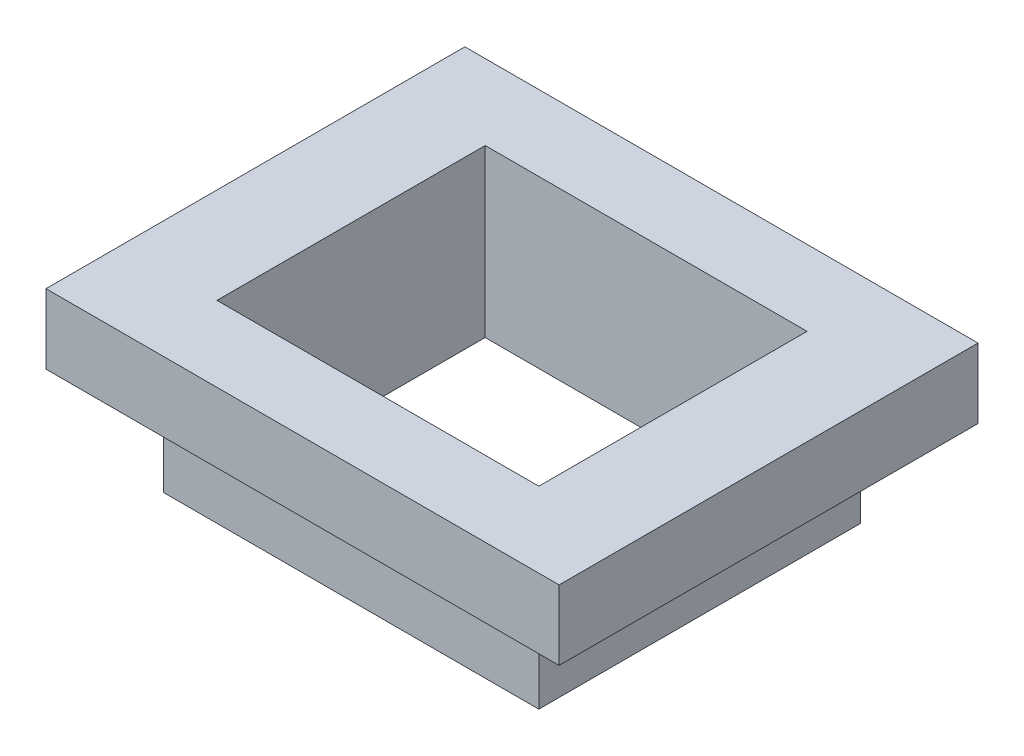
ISO-10303-21;
HEADER;
FILE_DESCRIPTION(('STEP AP214'),'2;1');
FILE_NAME('part.step','',(''),(''),'','','');
FILE_SCHEMA(('AUTOMOTIVE_DESIGN { 1 0 10303 214 1 1 1 1 }'));
ENDSEC;
DATA;
#1=APPLICATION_CONTEXT('core data for automotive mechanical design processes');
#2=APPLICATION_PROTOCOL_DEFINITION('international standard','automotive_design',2000,#1);
#3=PRODUCT_CONTEXT('',#1,'mechanical');
#4=PRODUCT('Part','Part','',(#3));
#5=PRODUCT_RELATED_PRODUCT_CATEGORY('part','',(#4));
#6=PRODUCT_DEFINITION_FORMATION('','',#4);
#7=PRODUCT_DEFINITION_CONTEXT('part definition',#1,'design');
#8=PRODUCT_DEFINITION('design','',#6,#7);
#9=PRODUCT_DEFINITION_SHAPE('','',#8);
#10=(LENGTH_UNIT() NAMED_UNIT(*) SI_UNIT(.MILLI.,.METRE.));
#11=(NAMED_UNIT(*) PLANE_ANGLE_UNIT() SI_UNIT($,.RADIAN.));
#12=(NAMED_UNIT(*) SI_UNIT($,.STERADIAN.) SOLID_ANGLE_UNIT());
#13=UNCERTAINTY_MEASURE_WITH_UNIT(LENGTH_MEASURE(1.E-05),#10,'distance_accuracy_value','');
#14=(GEOMETRIC_REPRESENTATION_CONTEXT(3) GLOBAL_UNCERTAINTY_ASSIGNED_CONTEXT((#13)) GLOBAL_UNIT_ASSIGNED_CONTEXT((#10,
#11,#12)) REPRESENTATION_CONTEXT('',''));
#15=CARTESIAN_POINT('',(0.,0.,0.));
#16=DIRECTION('',(0.,0.,1.));
#17=DIRECTION('',(1.,0.,0.));
#18=AXIS2_PLACEMENT_3D('',#15,#16,#17);
#19=CARTESIAN_POINT('',(0.,130.,0.));
#20=DIRECTION('',(0.,1.,0.));
#21=DIRECTION('',(0.,0.,1.));
#22=AXIS2_PLACEMENT_3D('',#19,#20,#21);
#23=PLANE('',#22);
#24=DIRECTION('',(0.,0.,1.));
#25=VECTOR('',#24,1.);
#26=CARTESIAN_POINT('',(-460.978313253012,130.,-161.342409638554));
#27=LINE('',#26,#25);
#28=CARTESIAN_POINT('',(-460.978313253012,130.,-161.342409638554));
#29=VERTEX_POINT('',#28);
#30=CARTESIAN_POINT('',(-460.978313253012,130.,619.537590361446));
#31=VERTEX_POINT('',#30);
#32=EDGE_CURVE('E193',#29,#31,#27,.T.);
#33=ORIENTED_EDGE('',*,*,#32,.T.);
#34=DIRECTION('',(1.,0.,0.));
#35=VECTOR('',#34,1.);
#36=CARTESIAN_POINT('',(-460.978313253012,130.,619.537590361446));
#37=LINE('',#36,#35);
#38=CARTESIAN_POINT('',(495.551686746988,130.,619.537590361446));
#39=VERTEX_POINT('',#38);
#40=EDGE_CURVE('E196',#31,#39,#37,.T.);
#41=ORIENTED_EDGE('',*,*,#40,.T.);
#42=DIRECTION('',(0.,0.,-1.));
#43=VECTOR('',#42,1.);
#44=CARTESIAN_POINT('',(495.551686746988,130.,-161.342409638554));
#45=LINE('',#44,#43);
#46=CARTESIAN_POINT('',(495.551686746988,130.,-161.342409638554));
#47=VERTEX_POINT('',#46);
#48=EDGE_CURVE('E199',#39,#47,#45,.T.);
#49=ORIENTED_EDGE('',*,*,#48,.T.);
#50=DIRECTION('',(-1.,0.,0.));
#51=VECTOR('',#50,1.);
#52=CARTESIAN_POINT('',(-460.978313253012,130.,-161.342409638554));
#53=LINE('',#52,#51);
#54=EDGE_CURVE('E201',#47,#29,#53,.T.);
#55=ORIENTED_EDGE('',*,*,#54,.T.);
#56=EDGE_LOOP('',(#33,#41,#49,#55));
#57=FACE_BOUND('',#56,.T.);
#58=DIRECTION('',(0.,0.,1.));
#59=VECTOR('',#58,1.);
#60=CARTESIAN_POINT('',(-282.713313253012,130.,229.097590361446));
#61=LINE('',#60,#59);
#62=CARTESIAN_POINT('',(-282.713313253012,130.,-20.9024096385541));
#63=VERTEX_POINT('',#62);
#64=CARTESIAN_POINT('',(-282.713313253012,130.,479.097590361446));
#65=VERTEX_POINT('',#64);
#66=EDGE_CURVE('E185',#63,#65,#61,.T.);
#67=ORIENTED_EDGE('',*,*,#66,.F.);
#68=DIRECTION('',(-1.,0.,0.));
#69=VECTOR('',#68,1.);
#70=CARTESIAN_POINT('',(17.2866867469881,130.,-20.9024096385542));
#71=LINE('',#70,#69);
#72=CARTESIAN_POINT('',(317.286686746988,130.,-20.9024096385542));
#73=VERTEX_POINT('',#72);
#74=EDGE_CURVE('E183',#73,#63,#71,.T.);
#75=ORIENTED_EDGE('',*,*,#74,.F.);
#76=DIRECTION('',(0.,0.,-1.));
#77=VECTOR('',#76,1.);
#78=CARTESIAN_POINT('',(317.286686746988,130.,229.097590361446));
#79=LINE('',#78,#77);
#80=CARTESIAN_POINT('',(317.286686746988,130.,479.097590361446));
#81=VERTEX_POINT('',#80);
#82=EDGE_CURVE('E128',#81,#73,#79,.T.);
#83=ORIENTED_EDGE('',*,*,#82,.F.);
#84=DIRECTION('',(1.,0.,0.));
#85=VECTOR('',#84,1.);
#86=CARTESIAN_POINT('',(17.286686746988,130.,479.097590361446));
#87=LINE('',#86,#85);
#88=EDGE_CURVE('E187',#65,#81,#87,.T.);
#89=ORIENTED_EDGE('',*,*,#88,.F.);
#90=EDGE_LOOP('',(#67,#75,#83,#89));
#91=FACE_BOUND('',#90,.T.);
#92=ADVANCED_FACE('F35',(#57,#91),#23,.T.);
#93=CARTESIAN_POINT('',(0.,0.,0.));
#94=DIRECTION('',(0.,1.,0.));
#95=DIRECTION('',(0.,0.,1.));
#96=AXIS2_PLACEMENT_3D('',#93,#94,#95);
#97=PLANE('',#96);
#98=DIRECTION('',(1.,0.,0.));
#99=VECTOR('',#98,1.);
#100=CARTESIAN_POINT('',(0.,0.,529.097590361446));
#101=LINE('',#100,#99);
#102=CARTESIAN_POINT('',(-332.713313253012,0.,529.097590361446));
#103=VERTEX_POINT('',#102);
#104=CARTESIAN_POINT('',(367.286686746988,0.,529.097590361446));
#105=VERTEX_POINT('',#104);
#106=EDGE_CURVE('E171',#103,#105,#101,.T.);
#107=ORIENTED_EDGE('',*,*,#106,.T.);
#108=DIRECTION('',(0.,0.,-1.));
#109=VECTOR('',#108,1.);
#110=CARTESIAN_POINT('',(367.286686746988,0.,0.));
#111=LINE('',#110,#109);
#112=CARTESIAN_POINT('',(367.286686746988,0.,-70.9024096385541));
#113=VERTEX_POINT('',#112);
#114=EDGE_CURVE('E168',#105,#113,#111,.T.);
#115=ORIENTED_EDGE('',*,*,#114,.T.);
#116=DIRECTION('',(-1.,0.,0.));
#117=VECTOR('',#116,1.);
#118=CARTESIAN_POINT('',(0.,0.,-70.9024096385541));
#119=LINE('',#118,#117);
#120=CARTESIAN_POINT('',(-332.713313253012,0.,-70.9024096385541));
#121=VERTEX_POINT('',#120);
#122=EDGE_CURVE('E148',#113,#121,#119,.T.);
#123=ORIENTED_EDGE('',*,*,#122,.T.);
#124=DIRECTION('',(0.,0.,1.));
#125=VECTOR('',#124,1.);
#126=CARTESIAN_POINT('',(-332.713313253012,0.,0.));
#127=LINE('',#126,#125);
#128=EDGE_CURVE('E50',#121,#103,#127,.T.);
#129=ORIENTED_EDGE('',*,*,#128,.T.);
#130=EDGE_LOOP('',(#107,#115,#123,#129));
#131=FACE_BOUND('',#130,.T.);
#132=DIRECTION('',(0.,0.,1.));
#133=VECTOR('',#132,1.);
#134=CARTESIAN_POINT('',(-460.978313253012,0.,-161.342409638554));
#135=LINE('',#134,#133);
#136=CARTESIAN_POINT('',(-460.978313253012,0.,-161.342409638554));
#137=VERTEX_POINT('',#136);
#138=CARTESIAN_POINT('',(-460.978313253012,0.,619.537590361446));
#139=VERTEX_POINT('',#138);
#140=EDGE_CURVE('E131',#137,#139,#135,.T.);
#141=ORIENTED_EDGE('',*,*,#140,.F.);
#142=DIRECTION('',(-1.,0.,0.));
#143=VECTOR('',#142,1.);
#144=CARTESIAN_POINT('',(-460.978313253012,0.,-161.342409638554));
#145=LINE('',#144,#143);
#146=CARTESIAN_POINT('',(495.551686746988,0.,-161.342409638554));
#147=VERTEX_POINT('',#146);
#148=EDGE_CURVE('E197',#147,#137,#145,.T.);
#149=ORIENTED_EDGE('',*,*,#148,.F.);
#150=DIRECTION('',(0.,0.,-1.));
#151=VECTOR('',#150,1.);
#152=CARTESIAN_POINT('',(495.551686746988,0.,-161.342409638554));
#153=LINE('',#152,#151);
#154=CARTESIAN_POINT('',(495.551686746988,0.,619.537590361446));
#155=VERTEX_POINT('',#154);
#156=EDGE_CURVE('E208',#155,#147,#153,.T.);
#157=ORIENTED_EDGE('',*,*,#156,.F.);
#158=DIRECTION('',(1.,0.,0.));
#159=VECTOR('',#158,1.);
#160=CARTESIAN_POINT('',(-460.978313253012,0.,619.537590361446));
#161=LINE('',#160,#159);
#162=EDGE_CURVE('E206',#139,#155,#161,.T.);
#163=ORIENTED_EDGE('',*,*,#162,.F.);
#164=EDGE_LOOP('',(#141,#149,#157,#163));
#165=FACE_BOUND('',#164,.T.);
#166=ADVANCED_FACE('F226',(#131,#165),#97,.F.);
#167=CARTESIAN_POINT('',(-460.978313253012,130.,-161.342409638554));
#168=DIRECTION('',(1.,0.,0.));
#169=DIRECTION('',(0.,0.,-1.));
#170=AXIS2_PLACEMENT_3D('',#167,#168,#169);
#171=PLANE('',#170);
#172=ORIENTED_EDGE('',*,*,#140,.T.);
#173=DIRECTION('',(0.,-1.,0.));
#174=VECTOR('',#173,1.);
#175=CARTESIAN_POINT('',(-460.978313253012,130.,619.537590361446));
#176=LINE('',#175,#174);
#177=EDGE_CURVE('E11',#31,#139,#176,.T.);
#178=ORIENTED_EDGE('',*,*,#177,.F.);
#179=ORIENTED_EDGE('',*,*,#32,.F.);
#180=DIRECTION('',(0.,-1.,0.));
#181=VECTOR('',#180,1.);
#182=CARTESIAN_POINT('',(-460.978313253012,130.,-161.342409638554));
#183=LINE('',#182,#181);
#184=EDGE_CURVE('E203',#29,#137,#183,.T.);
#185=ORIENTED_EDGE('',*,*,#184,.T.);
#186=EDGE_LOOP('',(#172,#178,#179,#185));
#187=FACE_BOUND('',#186,.T.);
#188=ADVANCED_FACE('F37',(#187),#171,.F.);
#189=CARTESIAN_POINT('',(-460.978313253012,130.,619.537590361446));
#190=DIRECTION('',(0.,0.,-1.));
#191=DIRECTION('',(-1.,0.,0.));
#192=AXIS2_PLACEMENT_3D('',#189,#190,#191);
#193=PLANE('',#192);
#194=ORIENTED_EDGE('',*,*,#162,.T.);
#195=DIRECTION('',(0.,-1.,0.));
#196=VECTOR('',#195,1.);
#197=CARTESIAN_POINT('',(495.551686746988,130.,619.537590361446));
#198=LINE('',#197,#196);
#199=EDGE_CURVE('E43',#39,#155,#198,.T.);
#200=ORIENTED_EDGE('',*,*,#199,.F.);
#201=ORIENTED_EDGE('',*,*,#40,.F.);
#202=ORIENTED_EDGE('',*,*,#177,.T.);
#203=EDGE_LOOP('',(#194,#200,#201,#202));
#204=FACE_BOUND('',#203,.T.);
#205=ADVANCED_FACE('F236',(#204),#193,.F.);
#206=CARTESIAN_POINT('',(495.551686746988,130.,-161.342409638554));
#207=DIRECTION('',(-1.,0.,0.));
#208=DIRECTION('',(0.,0.,1.));
#209=AXIS2_PLACEMENT_3D('',#206,#207,#208);
#210=PLANE('',#209);
#211=ORIENTED_EDGE('',*,*,#156,.T.);
#212=DIRECTION('',(0.,-1.,0.));
#213=VECTOR('',#212,1.);
#214=CARTESIAN_POINT('',(495.551686746988,130.,-161.342409638554));
#215=LINE('',#214,#213);
#216=EDGE_CURVE('E213',#47,#147,#215,.T.);
#217=ORIENTED_EDGE('',*,*,#216,.F.);
#218=ORIENTED_EDGE('',*,*,#48,.F.);
#219=ORIENTED_EDGE('',*,*,#199,.T.);
#220=EDGE_LOOP('',(#211,#217,#218,#219));
#221=FACE_BOUND('',#220,.T.);
#222=ADVANCED_FACE('F220',(#221),#210,.F.);
#223=CARTESIAN_POINT('',(-460.978313253012,130.,-161.342409638554));
#224=DIRECTION('',(0.,0.,1.));
#225=DIRECTION('',(1.,0.,0.));
#226=AXIS2_PLACEMENT_3D('',#223,#224,#225);
#227=PLANE('',#226);
#228=ORIENTED_EDGE('',*,*,#148,.T.);
#229=ORIENTED_EDGE('',*,*,#184,.F.);
#230=ORIENTED_EDGE('',*,*,#54,.F.);
#231=ORIENTED_EDGE('',*,*,#216,.T.);
#232=EDGE_LOOP('',(#228,#229,#230,#231));
#233=FACE_BOUND('',#232,.T.);
#234=ADVANCED_FACE('F229',(#233),#227,.F.);
#235=CARTESIAN_POINT('',(17.2866867469881,130.,-20.9024096385542));
#236=DIRECTION('',(0.,0.,1.));
#237=DIRECTION('',(1.,0.,0.));
#238=AXIS2_PLACEMENT_3D('',#235,#236,#237);
#239=PLANE('',#238);
#240=DIRECTION('',(0.,-1.,0.));
#241=VECTOR('',#240,1.);
#242=CARTESIAN_POINT('',(-282.713313253012,130.,-20.9024096385541));
#243=LINE('',#242,#241);
#244=CARTESIAN_POINT('',(-282.713313253012,-180.,-20.9024096385541));
#245=VERTEX_POINT('',#244);
#246=EDGE_CURVE('E132',#63,#245,#243,.T.);
#247=ORIENTED_EDGE('',*,*,#246,.T.);
#248=DIRECTION('',(-1.,0.,0.));
#249=VECTOR('',#248,1.);
#250=CARTESIAN_POINT('',(0.,-180.,-20.9024096385542));
#251=LINE('',#250,#249);
#252=CARTESIAN_POINT('',(317.286686746988,-180.,-20.9024096385542));
#253=VERTEX_POINT('',#252);
#254=EDGE_CURVE('E135',#253,#245,#251,.T.);
#255=ORIENTED_EDGE('',*,*,#254,.F.);
#256=DIRECTION('',(0.,-1.,0.));
#257=VECTOR('',#256,1.);
#258=CARTESIAN_POINT('',(317.286686746988,130.,-20.9024096385542));
#259=LINE('',#258,#257);
#260=EDGE_CURVE('E122',#73,#253,#259,.T.);
#261=ORIENTED_EDGE('',*,*,#260,.F.);
#262=ORIENTED_EDGE('',*,*,#74,.T.);
#263=EDGE_LOOP('',(#247,#255,#261,#262));
#264=FACE_BOUND('',#263,.T.);
#265=ADVANCED_FACE('F136',(#264),#239,.T.);
#266=CARTESIAN_POINT('',(-282.713313253012,130.,229.097590361446));
#267=DIRECTION('',(1.,0.,0.));
#268=DIRECTION('',(0.,0.,-1.));
#269=AXIS2_PLACEMENT_3D('',#266,#267,#268);
#270=PLANE('',#269);
#271=DIRECTION('',(0.,-1.,0.));
#272=VECTOR('',#271,1.);
#273=CARTESIAN_POINT('',(-282.713313253012,130.,479.097590361446));
#274=LINE('',#273,#272);
#275=CARTESIAN_POINT('',(-282.713313253012,-180.,479.097590361446));
#276=VERTEX_POINT('',#275);
#277=EDGE_CURVE('E190',#65,#276,#274,.T.);
#278=ORIENTED_EDGE('',*,*,#277,.T.);
#279=DIRECTION('',(0.,0.,1.));
#280=VECTOR('',#279,1.);
#281=CARTESIAN_POINT('',(-282.713313253012,-180.,1.25549931896623E-13));
#282=LINE('',#281,#280);
#283=EDGE_CURVE('E141',#245,#276,#282,.T.);
#284=ORIENTED_EDGE('',*,*,#283,.F.);
#285=ORIENTED_EDGE('',*,*,#246,.F.);
#286=ORIENTED_EDGE('',*,*,#66,.T.);
#287=EDGE_LOOP('',(#278,#284,#285,#286));
#288=FACE_BOUND('',#287,.T.);
#289=ADVANCED_FACE('F257',(#288),#270,.T.);
#290=CARTESIAN_POINT('',(17.286686746988,130.,479.097590361446));
#291=DIRECTION('',(0.,0.,-1.));
#292=DIRECTION('',(-1.,0.,0.));
#293=AXIS2_PLACEMENT_3D('',#290,#291,#292);
#294=PLANE('',#293);
#295=DIRECTION('',(0.,-1.,0.));
#296=VECTOR('',#295,1.);
#297=CARTESIAN_POINT('',(317.286686746988,130.,479.097590361446));
#298=LINE('',#297,#296);
#299=CARTESIAN_POINT('',(317.286686746988,-180.,479.097590361446));
#300=VERTEX_POINT('',#299);
#301=EDGE_CURVE('E58',#81,#300,#298,.T.);
#302=ORIENTED_EDGE('',*,*,#301,.T.);
#303=DIRECTION('',(1.,0.,0.));
#304=VECTOR('',#303,1.);
#305=CARTESIAN_POINT('',(0.,-180.,479.097590361446));
#306=LINE('',#305,#304);
#307=EDGE_CURVE('E147',#276,#300,#306,.T.);
#308=ORIENTED_EDGE('',*,*,#307,.F.);
#309=ORIENTED_EDGE('',*,*,#277,.F.);
#310=ORIENTED_EDGE('',*,*,#88,.T.);
#311=EDGE_LOOP('',(#302,#308,#309,#310));
#312=FACE_BOUND('',#311,.T.);
#313=ADVANCED_FACE('F261',(#312),#294,.T.);
#314=CARTESIAN_POINT('',(317.286686746988,130.,229.097590361446));
#315=DIRECTION('',(-1.,0.,0.));
#316=DIRECTION('',(0.,0.,1.));
#317=AXIS2_PLACEMENT_3D('',#314,#315,#316);
#318=PLANE('',#317);
#319=ORIENTED_EDGE('',*,*,#260,.T.);
#320=DIRECTION('',(0.,0.,-1.));
#321=VECTOR('',#320,1.);
#322=CARTESIAN_POINT('',(317.286686746988,-180.,-1.40903594013414E-13));
#323=LINE('',#322,#321);
#324=EDGE_CURVE('E126',#300,#253,#323,.T.);
#325=ORIENTED_EDGE('',*,*,#324,.F.);
#326=ORIENTED_EDGE('',*,*,#301,.F.);
#327=ORIENTED_EDGE('',*,*,#82,.T.);
#328=EDGE_LOOP('',(#319,#325,#326,#327));
#329=FACE_BOUND('',#328,.T.);
#330=ADVANCED_FACE('F124',(#329),#318,.T.);
#331=CARTESIAN_POINT('',(367.286686746988,-180.,0.));
#332=DIRECTION('',(1.,0.,0.));
#333=DIRECTION('',(0.,0.,-1.));
#334=AXIS2_PLACEMENT_3D('',#331,#332,#333);
#335=PLANE('',#334);
#336=ORIENTED_EDGE('',*,*,#114,.F.);
#337=DIRECTION('',(0.,1.,0.));
#338=VECTOR('',#337,1.);
#339=CARTESIAN_POINT('',(367.286686746988,-180.,529.097590361446));
#340=LINE('',#339,#338);
#341=CARTESIAN_POINT('',(367.286686746988,-180.,529.097590361446));
#342=VERTEX_POINT('',#341);
#343=EDGE_CURVE('E180',#342,#105,#340,.T.);
#344=ORIENTED_EDGE('',*,*,#343,.F.);
#345=DIRECTION('',(0.,0.,-1.));
#346=VECTOR('',#345,1.);
#347=CARTESIAN_POINT('',(367.286686746988,-180.,0.));
#348=LINE('',#347,#346);
#349=CARTESIAN_POINT('',(367.286686746988,-180.,-70.9024096385541));
#350=VERTEX_POINT('',#349);
#351=EDGE_CURVE('E155',#342,#350,#348,.T.);
#352=ORIENTED_EDGE('',*,*,#351,.T.);
#353=DIRECTION('',(0.,1.,0.));
#354=VECTOR('',#353,1.);
#355=CARTESIAN_POINT('',(367.286686746988,-180.,-70.9024096385541));
#356=LINE('',#355,#354);
#357=EDGE_CURVE('E167',#350,#113,#356,.T.);
#358=ORIENTED_EDGE('',*,*,#357,.T.);
#359=EDGE_LOOP('',(#336,#344,#352,#358));
#360=FACE_BOUND('',#359,.T.);
#361=ADVANCED_FACE('F271',(#360),#335,.T.);
#362=CARTESIAN_POINT('',(0.,-180.,529.097590361446));
#363=DIRECTION('',(0.,0.,1.));
#364=DIRECTION('',(1.,0.,0.));
#365=AXIS2_PLACEMENT_3D('',#362,#363,#364);
#366=PLANE('',#365);
#367=ORIENTED_EDGE('',*,*,#106,.F.);
#368=DIRECTION('',(0.,1.,0.));
#369=VECTOR('',#368,1.);
#370=CARTESIAN_POINT('',(-332.713313253012,-180.,529.097590361446));
#371=LINE('',#370,#369);
#372=CARTESIAN_POINT('',(-332.713313253012,-180.,529.097590361446));
#373=VERTEX_POINT('',#372);
#374=EDGE_CURVE('E178',#373,#103,#371,.T.);
#375=ORIENTED_EDGE('',*,*,#374,.F.);
#376=DIRECTION('',(1.,0.,0.));
#377=VECTOR('',#376,1.);
#378=CARTESIAN_POINT('',(0.,-180.,529.097590361446));
#379=LINE('',#378,#377);
#380=EDGE_CURVE('E158',#373,#342,#379,.T.);
#381=ORIENTED_EDGE('',*,*,#380,.T.);
#382=ORIENTED_EDGE('',*,*,#343,.T.);
#383=EDGE_LOOP('',(#367,#375,#381,#382));
#384=FACE_BOUND('',#383,.T.);
#385=ADVANCED_FACE('F274',(#384),#366,.T.);
#386=CARTESIAN_POINT('',(-332.713313253012,-180.,0.));
#387=DIRECTION('',(-1.,0.,0.));
#388=DIRECTION('',(0.,0.,1.));
#389=AXIS2_PLACEMENT_3D('',#386,#387,#388);
#390=PLANE('',#389);
#391=ORIENTED_EDGE('',*,*,#128,.F.);
#392=DIRECTION('',(0.,1.,0.));
#393=VECTOR('',#392,1.);
#394=CARTESIAN_POINT('',(-332.713313253012,-180.,-70.9024096385541));
#395=LINE('',#394,#393);
#396=CARTESIAN_POINT('',(-332.713313253012,-180.,-70.9024096385541));
#397=VERTEX_POINT('',#396);
#398=EDGE_CURVE('E176',#397,#121,#395,.T.);
#399=ORIENTED_EDGE('',*,*,#398,.F.);
#400=DIRECTION('',(0.,0.,1.));
#401=VECTOR('',#400,1.);
#402=CARTESIAN_POINT('',(-332.713313253012,-180.,0.));
#403=LINE('',#402,#401);
#404=EDGE_CURVE('E161',#397,#373,#403,.T.);
#405=ORIENTED_EDGE('',*,*,#404,.T.);
#406=ORIENTED_EDGE('',*,*,#374,.T.);
#407=EDGE_LOOP('',(#391,#399,#405,#406));
#408=FACE_BOUND('',#407,.T.);
#409=ADVANCED_FACE('F278',(#408),#390,.T.);
#410=CARTESIAN_POINT('',(0.,-180.,-70.9024096385541));
#411=DIRECTION('',(0.,0.,-1.));
#412=DIRECTION('',(-1.,0.,0.));
#413=AXIS2_PLACEMENT_3D('',#410,#411,#412);
#414=PLANE('',#413);
#415=ORIENTED_EDGE('',*,*,#122,.F.);
#416=ORIENTED_EDGE('',*,*,#357,.F.);
#417=DIRECTION('',(-1.,0.,0.));
#418=VECTOR('',#417,1.);
#419=CARTESIAN_POINT('',(0.,-180.,-70.9024096385541));
#420=LINE('',#419,#418);
#421=EDGE_CURVE('E164',#350,#397,#420,.T.);
#422=ORIENTED_EDGE('',*,*,#421,.T.);
#423=ORIENTED_EDGE('',*,*,#398,.T.);
#424=EDGE_LOOP('',(#415,#416,#422,#423));
#425=FACE_BOUND('',#424,.T.);
#426=ADVANCED_FACE('F282',(#425),#414,.T.);
#427=CARTESIAN_POINT('',(0.,-180.,0.));
#428=DIRECTION('',(0.,-1.,0.));
#429=DIRECTION('',(0.,0.,-1.));
#430=AXIS2_PLACEMENT_3D('',#427,#428,#429);
#431=PLANE('',#430);
#432=ORIENTED_EDGE('',*,*,#324,.T.);
#433=ORIENTED_EDGE('',*,*,#254,.T.);
#434=ORIENTED_EDGE('',*,*,#283,.T.);
#435=ORIENTED_EDGE('',*,*,#307,.T.);
#436=EDGE_LOOP('',(#432,#433,#434,#435));
#437=FACE_BOUND('',#436,.T.);
#438=ORIENTED_EDGE('',*,*,#351,.F.);
#439=ORIENTED_EDGE('',*,*,#380,.F.);
#440=ORIENTED_EDGE('',*,*,#404,.F.);
#441=ORIENTED_EDGE('',*,*,#421,.F.);
#442=EDGE_LOOP('',(#438,#439,#440,#441));
#443=FACE_BOUND('',#442,.T.);
#444=ADVANCED_FACE('F144',(#437,#443),#431,.T.);
#445=CLOSED_SHELL('',(#92,#166,#188,#205,#222,#234,#265,#289,#313,#330,#361,#385,#409,#426,#444));
#446=MANIFOLD_SOLID_BREP('B2',#445);
#447=ADVANCED_BREP_SHAPE_REPRESENTATION('',(#18,#446),#14);
#448=SHAPE_DEFINITION_REPRESENTATION(#9,#447);
ENDSEC;
END-ISO-10303-21;
